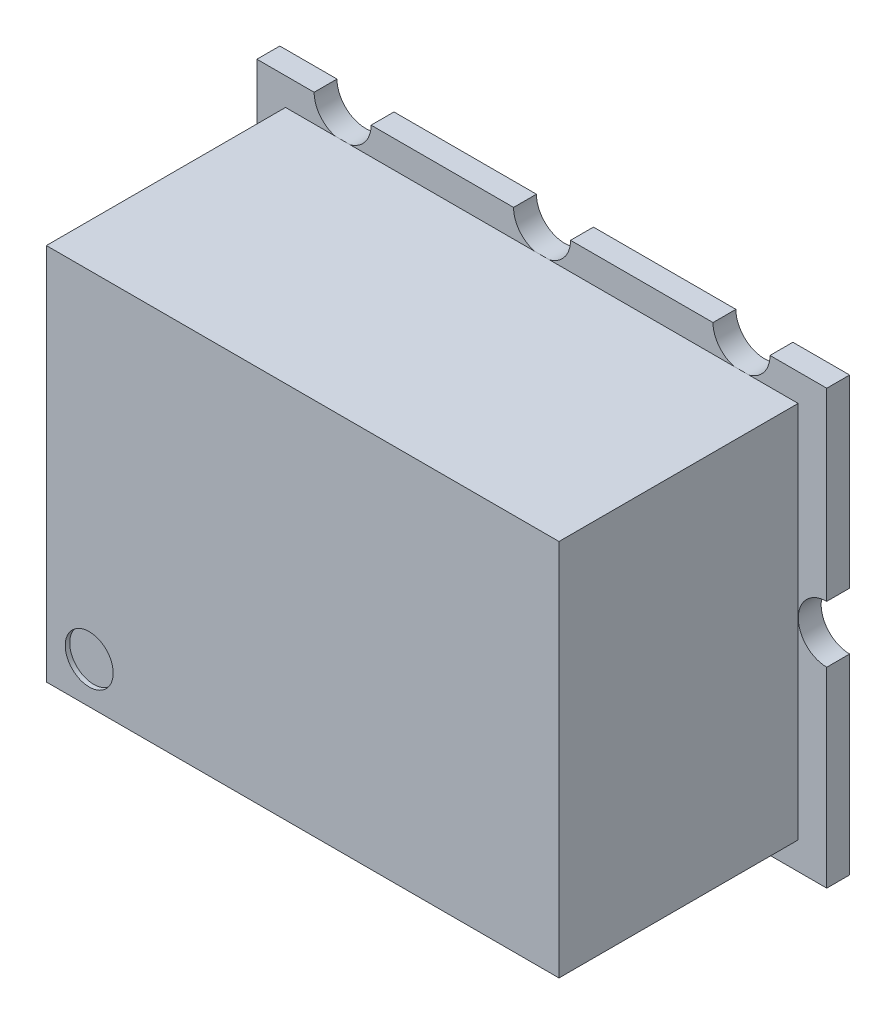
ISO-10303-21;
HEADER;
FILE_DESCRIPTION(('STEP AP214'),'2;1');
FILE_NAME('part.step','',(''),(''),'','','');
FILE_SCHEMA(('AUTOMOTIVE_DESIGN { 1 0 10303 214 1 1 1 1 }'));
ENDSEC;
DATA;
#1=APPLICATION_CONTEXT('core data for automotive mechanical design processes');
#2=APPLICATION_PROTOCOL_DEFINITION('international standard','automotive_design',2000,#1);
#3=PRODUCT_CONTEXT('',#1,'mechanical');
#4=PRODUCT('Part','Part','',(#3));
#5=PRODUCT_RELATED_PRODUCT_CATEGORY('part','',(#4));
#6=PRODUCT_DEFINITION_FORMATION('','',#4);
#7=PRODUCT_DEFINITION_CONTEXT('part definition',#1,'design');
#8=PRODUCT_DEFINITION('design','',#6,#7);
#9=PRODUCT_DEFINITION_SHAPE('','',#8);
#10=(LENGTH_UNIT() NAMED_UNIT(*) SI_UNIT(.MILLI.,.METRE.));
#11=(NAMED_UNIT(*) PLANE_ANGLE_UNIT() SI_UNIT($,.RADIAN.));
#12=(NAMED_UNIT(*) SI_UNIT($,.STERADIAN.) SOLID_ANGLE_UNIT());
#13=UNCERTAINTY_MEASURE_WITH_UNIT(LENGTH_MEASURE(1.E-05),#10,'distance_accuracy_value','');
#14=(GEOMETRIC_REPRESENTATION_CONTEXT(3) GLOBAL_UNCERTAINTY_ASSIGNED_CONTEXT((#13)) GLOBAL_UNIT_ASSIGNED_CONTEXT((#10,
#11,#12)) REPRESENTATION_CONTEXT('',''));
#15=CARTESIAN_POINT('',(0.,0.,0.));
#16=DIRECTION('',(0.,0.,1.));
#17=DIRECTION('',(1.,0.,0.));
#18=AXIS2_PLACEMENT_3D('',#15,#16,#17);
#19=CARTESIAN_POINT('',(0.000121919998536282,8.10247244868378E-05,5.85219199970364));
#20=DIRECTION('',(0.,-4.37113882867379E-08,0.999999999999999));
#21=DIRECTION('',(0.999999999999985,1.74845553146949E-07,0.));
#22=AXIS2_PLACEMENT_3D('',#19,#20,#21);
#23=PLANE('',#22);
#24=CARTESIAN_POINT('',(-4.75761193607172,-3.29649685020592,5.85219185560568));
#25=DIRECTION('',(0.,-4.37113882867379E-08,0.999999999999999));
#26=DIRECTION('',(0.999999999999985,1.74845553146949E-07,0.));
#27=AXIS2_PLACEMENT_3D('',#24,#25,#26);
#28=CIRCLE('',#27,0.53461435879999);
#29=CARTESIAN_POINT('',(-4.22299757727173,-3.29649675673098,5.85219185560568));
#30=VERTEX_POINT('',#29);
#31=EDGE_CURVE('E9',#30,#30,#28,.T.);
#32=ORIENTED_EDGE('',*,*,#31,.F.);
#33=EDGE_LOOP('',(#32));
#34=FACE_BOUND('',#33,.T.);
#35=DIRECTION('',(1.74845553146949E-07,-0.999999999999984,-4.37113882867386E-08));
#36=VECTOR('',#35,1.);
#37=CARTESIAN_POINT('',(-5.71237881656946,4.21275839991622,5.85219218384566));
#38=LINE('',#37,#36);
#39=CARTESIAN_POINT('',(-5.71237881656946,4.21275839991622,5.85219218384566));
#40=VERTEX_POINT('',#39);
#41=CARTESIAN_POINT('',(-5.7123773434333,-4.21259834807769,5.85219181556162));
#42=VERTEX_POINT('',#41);
#43=EDGE_CURVE('E22',#40,#42,#38,.T.);
#44=ORIENTED_EDGE('',*,*,#43,.T.);
#45=DIRECTION('',(0.999999999999985,1.74845553146949E-07,0.));
#46=VECTOR('',#45,1.);
#47=CARTESIAN_POINT('',(-5.7123773434333,-4.21259834807769,5.85219181556162));
#48=LINE('',#47,#46);
#49=CARTESIAN_POINT('',(5.71262265656653,-4.21259635046724,5.85219181556162));
#50=VERTEX_POINT('',#49);
#51=EDGE_CURVE('E393',#42,#50,#48,.T.);
#52=ORIENTED_EDGE('',*,*,#51,.T.);
#53=DIRECTION('',(-1.74845553146949E-07,0.999999999999984,4.37113882867386E-08));
#54=VECTOR('',#53,1.);
#55=CARTESIAN_POINT('',(5.71262265656653,-4.21259635046724,5.85219181556162));
#56=LINE('',#55,#54);
#57=CARTESIAN_POINT('',(5.71262118343037,4.21276039752666,5.85219218384566));
#58=VERTEX_POINT('',#57);
#59=EDGE_CURVE('E390',#50,#58,#56,.T.);
#60=ORIENTED_EDGE('',*,*,#59,.T.);
#61=DIRECTION('',(-0.999999999999985,-1.74845553146949E-07,0.));
#62=VECTOR('',#61,1.);
#63=CARTESIAN_POINT('',(5.71262118343037,4.21276039752666,5.85219218384566));
#64=LINE('',#63,#62);
#65=EDGE_CURVE('E388',#58,#40,#64,.T.);
#66=ORIENTED_EDGE('',*,*,#65,.T.);
#67=EDGE_LOOP('',(#44,#52,#60,#66));
#68=FACE_BOUND('',#67,.T.);
#69=ADVANCED_FACE('F15',(#34,#68),#23,.T.);
#70=CARTESIAN_POINT('',(-4.75761193607172,-3.29649684583478,5.75219185560568));
#71=DIRECTION('',(0.,-4.37113882867379E-08,0.999999999999999));
#72=DIRECTION('',(0.999999999999985,1.74845553146949E-07,0.));
#73=AXIS2_PLACEMENT_3D('',#70,#71,#72);
#74=CYLINDRICAL_SURFACE('',#73,0.53461435879999);
#75=ORIENTED_EDGE('',*,*,#31,.T.);
#76=DIRECTION('',(0.,-4.37113882867379E-08,0.999999999999999));
#77=VECTOR('',#76,1.);
#78=CARTESIAN_POINT('',(-4.22299757727174,-3.29649675235984,5.75219185560568));
#79=LINE('',#78,#77);
#80=CARTESIAN_POINT('',(-4.22299757727174,-3.29649675235984,5.75219185560568));
#81=VERTEX_POINT('',#80);
#82=EDGE_CURVE('E386',#81,#30,#79,.T.);
#83=ORIENTED_EDGE('',*,*,#82,.F.);
#84=CARTESIAN_POINT('',(-4.75761193607172,-3.29649684583478,5.75219185560568));
#85=DIRECTION('',(0.,-4.37113882867379E-08,0.999999999999999));
#86=DIRECTION('',(0.999999999999985,1.74845553146949E-07,0.));
#87=AXIS2_PLACEMENT_3D('',#84,#85,#86);
#88=CIRCLE('',#87,0.53461435879999);
#89=EDGE_CURVE('E383',#81,#81,#88,.T.);
#90=ORIENTED_EDGE('',*,*,#89,.F.);
#91=ORIENTED_EDGE('',*,*,#82,.T.);
#92=EDGE_LOOP('',(#75,#83,#90,#91));
#93=FACE_BOUND('',#92,.T.);
#94=ADVANCED_FACE('F435',(#93),#74,.F.);
#95=CARTESIAN_POINT('',(-5.7123788165695,4.21275863289792,0.522192183845666));
#96=DIRECTION('',(-0.999999999999985,-1.74845553146949E-07,0.));
#97=DIRECTION('',(1.74845553146949E-07,-0.999999999999984,-4.37113882867386E-08));
#98=AXIS2_PLACEMENT_3D('',#95,#96,#97);
#99=PLANE('',#98);
#100=DIRECTION('',(1.74845553146949E-07,-0.999999999999984,-4.37113882867386E-08));
#101=VECTOR('',#100,1.);
#102=CARTESIAN_POINT('',(-5.7123788165695,4.21275863289792,0.522192183845666));
#103=LINE('',#102,#101);
#104=CARTESIAN_POINT('',(-5.7123788165695,4.21275863289792,0.522192183845666));
#105=VERTEX_POINT('',#104);
#106=CARTESIAN_POINT('',(-5.71237734343334,-4.21259811509599,0.522191815561625));
#107=VERTEX_POINT('',#106);
#108=EDGE_CURVE('E380',#105,#107,#103,.T.);
#109=ORIENTED_EDGE('',*,*,#108,.T.);
#110=DIRECTION('',(0.,-4.37113882867379E-08,0.999999999999999));
#111=VECTOR('',#110,1.);
#112=CARTESIAN_POINT('',(-5.71237734343334,-4.21259811509599,0.522191815561625));
#113=LINE('',#112,#111);
#114=EDGE_CURVE('E377',#107,#42,#113,.T.);
#115=ORIENTED_EDGE('',*,*,#114,.T.);
#116=ORIENTED_EDGE('',*,*,#43,.F.);
#117=DIRECTION('',(0.,-4.37113882867379E-08,0.999999999999999));
#118=VECTOR('',#117,1.);
#119=CARTESIAN_POINT('',(-5.7123788165695,4.21275863289792,0.522192183845666));
#120=LINE('',#119,#118);
#121=EDGE_CURVE('E374',#105,#40,#120,.T.);
#122=ORIENTED_EDGE('',*,*,#121,.F.);
#123=EDGE_LOOP('',(#109,#115,#116,#122));
#124=FACE_BOUND('',#123,.T.);
#125=ADVANCED_FACE('F415',(#124),#99,.T.);
#126=CARTESIAN_POINT('',(-5.71237734343334,-4.21259811509599,0.522191815561625));
#127=DIRECTION('',(1.74845553146949E-07,-0.999999999999984,-4.37113882867386E-08));
#128=DIRECTION('',(0.999999999999985,1.74845553146949E-07,0.));
#129=AXIS2_PLACEMENT_3D('',#126,#127,#128);
#130=PLANE('',#129);
#131=DIRECTION('',(0.999999999999985,1.74845553146949E-07,0.));
#132=VECTOR('',#131,1.);
#133=CARTESIAN_POINT('',(-5.71237734343334,-4.21259811509599,0.522191815561625));
#134=LINE('',#133,#132);
#135=CARTESIAN_POINT('',(-0.168065411764872,-4.2125971456977,0.522191815561625));
#136=VERTEX_POINT('',#135);
#137=EDGE_CURVE('E371',#107,#136,#134,.T.);
#138=ORIENTED_EDGE('',*,*,#137,.T.);
#139=DIRECTION('',(0.999999999999985,1.74845553146949E-07,0.));
#140=VECTOR('',#139,1.);
#141=CARTESIAN_POINT('',(-0.168065411764869,-4.2125971456977,0.522191815561625));
#142=LINE('',#141,#140);
#143=CARTESIAN_POINT('',(0.168310724898024,-4.21259708688383,0.522191815561625));
#144=VERTEX_POINT('',#143);
#145=EDGE_CURVE('E368',#136,#144,#142,.T.);
#146=ORIENTED_EDGE('',*,*,#145,.T.);
#147=DIRECTION('',(0.999999999999985,1.74845553146949E-07,0.));
#148=VECTOR('',#147,1.);
#149=CARTESIAN_POINT('',(0.168310724898038,-4.21259708688383,0.522191815561625));
#150=LINE('',#149,#148);
#151=CARTESIAN_POINT('',(5.71262265656649,-4.21259611748554,0.522191815561625));
#152=VERTEX_POINT('',#151);
#153=EDGE_CURVE('E365',#144,#152,#150,.T.);
#154=ORIENTED_EDGE('',*,*,#153,.T.);
#155=DIRECTION('',(0.,-4.37113882867379E-08,0.999999999999999));
#156=VECTOR('',#155,1.);
#157=CARTESIAN_POINT('',(5.71262265656649,-4.21259611748554,0.522191815561625));
#158=LINE('',#157,#156);
#159=EDGE_CURVE('E362',#152,#50,#158,.T.);
#160=ORIENTED_EDGE('',*,*,#159,.T.);
#161=ORIENTED_EDGE('',*,*,#51,.F.);
#162=ORIENTED_EDGE('',*,*,#114,.F.);
#163=EDGE_LOOP('',(#138,#146,#154,#160,#161,#162));
#164=FACE_BOUND('',#163,.T.);
#165=ADVANCED_FACE('F401',(#164),#130,.T.);
#166=CARTESIAN_POINT('',(5.71262265656649,-4.21259611748554,0.522191815561625));
#167=DIRECTION('',(0.999999999999985,1.74845553146949E-07,0.));
#168=DIRECTION('',(-1.74845553146949E-07,0.999999999999984,4.37113882867386E-08));
#169=AXIS2_PLACEMENT_3D('',#166,#167,#168);
#170=PLANE('',#169);
#171=DIRECTION('',(-1.74845553146949E-07,0.999999999999984,4.37113882867386E-08));
#172=VECTOR('',#171,1.);
#173=CARTESIAN_POINT('',(5.71262265656649,-4.21259611748554,0.522191815561625));
#174=LINE('',#173,#172);
#175=CARTESIAN_POINT('',(5.71262118343033,4.21276063050836,0.522192183845666));
#176=VERTEX_POINT('',#175);
#177=EDGE_CURVE('E360',#152,#176,#174,.T.);
#178=ORIENTED_EDGE('',*,*,#177,.T.);
#179=DIRECTION('',(0.,-4.37113882867379E-08,0.999999999999999));
#180=VECTOR('',#179,1.);
#181=CARTESIAN_POINT('',(5.71262118343033,4.21276063050836,0.522192183845666));
#182=LINE('',#181,#180);
#183=EDGE_CURVE('E357',#176,#58,#182,.T.);
#184=ORIENTED_EDGE('',*,*,#183,.T.);
#185=ORIENTED_EDGE('',*,*,#59,.F.);
#186=ORIENTED_EDGE('',*,*,#159,.F.);
#187=EDGE_LOOP('',(#178,#184,#185,#186));
#188=FACE_BOUND('',#187,.T.);
#189=ADVANCED_FACE('F399',(#188),#170,.T.);
#190=CARTESIAN_POINT('',(5.71262118343033,4.21276063050836,0.522192183845666));
#191=DIRECTION('',(-1.74845553146949E-07,0.999999999999984,4.37113882867386E-08));
#192=DIRECTION('',(-0.999999999999985,-1.74845553146949E-07,0.));
#193=AXIS2_PLACEMENT_3D('',#190,#191,#192);
#194=PLANE('',#193);
#195=DIRECTION('',(-0.999999999999985,-1.74845553146949E-07,0.));
#196=VECTOR('',#195,1.);
#197=CARTESIAN_POINT('',(5.71262118343033,4.21276063050836,0.522192183845666));
#198=LINE('',#197,#196);
#199=CARTESIAN_POINT('',(4.61830925176178,4.21276043917279,0.522192183845666));
#200=VERTEX_POINT('',#199);
#201=EDGE_CURVE('E355',#176,#200,#198,.T.);
#202=ORIENTED_EDGE('',*,*,#201,.T.);
#203=DIRECTION('',(-0.999999999999985,-1.74845553146949E-07,0.));
#204=VECTOR('',#203,1.);
#205=CARTESIAN_POINT('',(4.61830925176178,4.21276043917279,0.522192183845666));
#206=LINE('',#205,#204);
#207=CARTESIAN_POINT('',(4.28193311509891,4.21276038035891,0.522192183845666));
#208=VERTEX_POINT('',#207);
#209=EDGE_CURVE('E352',#200,#208,#206,.T.);
#210=ORIENTED_EDGE('',*,*,#209,.T.);
#211=DIRECTION('',(-0.999999999999985,-1.74845553146949E-07,0.));
#212=VECTOR('',#211,1.);
#213=CARTESIAN_POINT('',(4.28193311509891,4.21276038035891,0.522192183845666));
#214=LINE('',#213,#212);
#215=CARTESIAN_POINT('',(0.173309251761861,4.2127596619843,0.522192183845666));
#216=VERTEX_POINT('',#215);
#217=EDGE_CURVE('E349',#208,#216,#214,.T.);
#218=ORIENTED_EDGE('',*,*,#217,.T.);
#219=DIRECTION('',(-0.999999999999985,-1.74845553146949E-07,0.));
#220=VECTOR('',#219,1.);
#221=CARTESIAN_POINT('',(0.173309251761862,4.2127596619843,0.522192183845666));
#222=LINE('',#221,#220);
#223=CARTESIAN_POINT('',(-0.163066884901022,4.21275960317043,0.522192183845666));
#224=VERTEX_POINT('',#223);
#225=EDGE_CURVE('E347',#216,#224,#222,.T.);
#226=ORIENTED_EDGE('',*,*,#225,.T.);
#227=DIRECTION('',(-0.999999999999985,-1.74845553146949E-07,0.));
#228=VECTOR('',#227,1.);
#229=CARTESIAN_POINT('',(-0.163066884901022,4.21275960317043,0.522192183845666));
#230=LINE('',#229,#228);
#231=CARTESIAN_POINT('',(-4.27169074823806,4.21275888479582,0.522192183845666));
#232=VERTEX_POINT('',#231);
#233=EDGE_CURVE('E345',#224,#232,#230,.T.);
#234=ORIENTED_EDGE('',*,*,#233,.T.);
#235=DIRECTION('',(-0.999999999999985,-1.74845553146949E-07,0.));
#236=VECTOR('',#235,1.);
#237=CARTESIAN_POINT('',(-4.27169074823806,4.21275888479582,0.522192183845666));
#238=LINE('',#237,#236);
#239=CARTESIAN_POINT('',(-4.60806688490099,4.21275882598195,0.522192183845666));
#240=VERTEX_POINT('',#239);
#241=EDGE_CURVE('E343',#232,#240,#238,.T.);
#242=ORIENTED_EDGE('',*,*,#241,.T.);
#243=DIRECTION('',(-0.999999999999985,-1.74845553146949E-07,0.));
#244=VECTOR('',#243,1.);
#245=CARTESIAN_POINT('',(-4.60806688490102,4.21275882598195,0.522192183845666));
#246=LINE('',#245,#244);
#247=EDGE_CURVE('E340',#240,#105,#246,.T.);
#248=ORIENTED_EDGE('',*,*,#247,.T.);
#249=ORIENTED_EDGE('',*,*,#121,.T.);
#250=ORIENTED_EDGE('',*,*,#65,.F.);
#251=ORIENTED_EDGE('',*,*,#183,.F.);
#252=EDGE_LOOP('',(#202,#210,#218,#226,#234,#242,#248,#249,#250,#251));
#253=FACE_BOUND('',#252,.T.);
#254=ADVANCED_FACE('F410',(#253),#194,.T.);
#255=CARTESIAN_POINT('',(0.000121919998535518,8.10290956256665E-05,5.75219199970364));
#256=DIRECTION('',(0.,-4.37113882867379E-08,0.999999999999999));
#257=DIRECTION('',(0.999999999999985,1.74845553146949E-07,0.));
#258=AXIS2_PLACEMENT_3D('',#255,#256,#257);
#259=PLANE('',#258);
#260=ORIENTED_EDGE('',*,*,#89,.T.);
#261=EDGE_LOOP('',(#260));
#262=FACE_BOUND('',#261,.T.);
#263=ADVANCED_FACE('F432',(#262),#259,.T.);
#264=CARTESIAN_POINT('',(0.000121919998495546,8.12577061864062E-05,0.522191999703645));
#265=DIRECTION('',(0.,-4.37113882867379E-08,0.999999999999999));
#266=DIRECTION('',(0.999999999999985,1.74845553146949E-07,0.));
#267=AXIS2_PLACEMENT_3D('',#264,#265,#266);
#268=PLANE('',#267);
#269=ORIENTED_EDGE('',*,*,#108,.F.);
#270=ORIENTED_EDGE('',*,*,#247,.F.);
#271=CARTESIAN_POINT('',(-4.43987892363123,4.82508048139185,0.522192210611094));
#272=DIRECTION('',(0.,4.37113882867379E-08,-0.999999999999999));
#273=DIRECTION('',(-0.264862931133474,-0.964286071511656,-4.21502808670601E-08));
#274=AXIS2_PLACEMENT_3D('',#271,#272,#273);
#275=CIRCLE('',#274,0.635);
#276=CARTESIAN_POINT('',(-5.07487892363121,4.82508037036493,0.522192210611094));
#277=VERTEX_POINT('',#276);
#278=EDGE_CURVE('E337',#240,#277,#275,.T.);
#279=ORIENTED_EDGE('',*,*,#278,.T.);
#280=DIRECTION('',(-0.999999999999985,-1.74845552450339E-07,0.));
#281=VECTOR('',#280,1.);
#282=CARTESIAN_POINT('',(-5.07487892363121,4.82508037036493,0.522192210611094));
#283=LINE('',#282,#281);
#284=CARTESIAN_POINT('',(-6.3498789236312,4.82508014743685,0.522192210611094));
#285=VERTEX_POINT('',#284);
#286=EDGE_CURVE('E335',#277,#285,#283,.T.);
#287=ORIENTED_EDGE('',*,*,#286,.T.);
#288=DIRECTION('',(1.74845553146949E-07,-0.999999999999984,-4.37113882867386E-08));
#289=VECTOR('',#288,1.);
#290=CARTESIAN_POINT('',(-6.3498789236312,4.82508014743685,0.522192210611094));
#291=LINE('',#290,#289);
#292=CARTESIAN_POINT('',(-6.34987820414175,0.710080147436914,0.522192030738731));
#293=VERTEX_POINT('',#292);
#294=EDGE_CURVE('E333',#285,#293,#291,.T.);
#295=ORIENTED_EDGE('',*,*,#294,.T.);
#296=CARTESIAN_POINT('',(-6.34987809311482,0.0750801474369238,0.522192002981999));
#297=DIRECTION('',(0.,4.37113882867379E-08,-0.999999999999999));
#298=DIRECTION('',(-1.74845553146949E-07,0.999999999999984,4.37113882867386E-08));
#299=AXIS2_PLACEMENT_3D('',#296,#297,#298);
#300=CIRCLE('',#299,0.635);
#301=CARTESIAN_POINT('',(-6.3498779820879,-0.559919852563065,0.522191975225268));
#302=VERTEX_POINT('',#301);
#303=EDGE_CURVE('E331',#293,#302,#300,.T.);
#304=ORIENTED_EDGE('',*,*,#303,.T.);
#305=DIRECTION('',(1.74845553146949E-07,-0.999999999999984,-4.37113882867386E-08));
#306=VECTOR('',#305,1.);
#307=CARTESIAN_POINT('',(-6.3498779820879,-0.559919852563065,0.522191975225268));
#308=LINE('',#307,#306);
#309=CARTESIAN_POINT('',(-6.34987723637161,-4.824919852563,0.522191788796197));
#310=VERTEX_POINT('',#309);
#311=EDGE_CURVE('E329',#302,#310,#308,.T.);
#312=ORIENTED_EDGE('',*,*,#311,.T.);
#313=DIRECTION('',(0.999999999999985,1.74845553146949E-07,0.));
#314=VECTOR('',#313,1.);
#315=CARTESIAN_POINT('',(-6.34987723637161,-4.824919852563,0.522191788796197));
#316=LINE('',#315,#314);
#317=CARTESIAN_POINT('',(-0.634877236371702,-4.82491885332066,0.522191788796197));
#318=VERTEX_POINT('',#317);
#319=EDGE_CURVE('E326',#310,#318,#316,.T.);
#320=ORIENTED_EDGE('',*,*,#319,.T.);
#321=CARTESIAN_POINT('',(0.000122763628288592,-4.82491874229373,0.522191788796197));
#322=DIRECTION('',(0.,4.37113882867379E-08,-0.999999999999999));
#323=DIRECTION('',(-0.999999999999985,-1.74845553146949E-07,0.));
#324=AXIS2_PLACEMENT_3D('',#321,#322,#323);
#325=CIRCLE('',#324,0.635);
#326=EDGE_CURVE('E324',#318,#136,#325,.T.);
#327=ORIENTED_EDGE('',*,*,#326,.T.);
#328=ORIENTED_EDGE('',*,*,#137,.F.);
#329=EDGE_LOOP('',(#269,#270,#279,#287,#295,#304,#312,#320,#327,#328));
#330=FACE_BOUND('',#329,.T.);
#331=ADVANCED_FACE('F423',(#330),#268,.T.);
#332=CARTESIAN_POINT('',(0.000121919998495546,8.12577061864062E-05,0.522191999703645));
#333=DIRECTION('',(0.,-4.37113882867379E-08,0.999999999999999));
#334=DIRECTION('',(0.999999999999985,1.74845553146949E-07,0.));
#335=AXIS2_PLACEMENT_3D('',#332,#333,#334);
#336=PLANE('',#335);
#337=CARTESIAN_POINT('',(0.000122763628288592,-4.82491874229373,0.522191788796197));
#338=DIRECTION('',(0.,4.37113882867379E-08,-0.999999999999999));
#339=DIRECTION('',(-0.264863268335678,0.964285978891398,4.21502808670607E-08));
#340=AXIS2_PLACEMENT_3D('',#337,#338,#339);
#341=CIRCLE('',#340,0.635);
#342=EDGE_CURVE('E322',#136,#144,#341,.T.);
#343=ORIENTED_EDGE('',*,*,#342,.T.);
#344=ORIENTED_EDGE('',*,*,#145,.F.);
#345=EDGE_LOOP('',(#343,#344));
#346=FACE_BOUND('',#345,.T.);
#347=ADVANCED_FACE('F421',(#346),#336,.F.);
#348=CARTESIAN_POINT('',(0.000121919998495546,8.12577061864062E-05,0.522191999703645));
#349=DIRECTION('',(0.,-4.37113882867379E-08,0.999999999999999));
#350=DIRECTION('',(0.999999999999985,1.74845553146949E-07,0.));
#351=AXIS2_PLACEMENT_3D('',#348,#349,#350);
#352=PLANE('',#351);
#353=ORIENTED_EDGE('',*,*,#153,.F.);
#354=CARTESIAN_POINT('',(0.000122763628288592,-4.82491874229373,0.522191788796197));
#355=DIRECTION('',(0.,4.37113882867379E-08,-0.999999999999999));
#356=DIRECTION('',(0.264862931133434,0.964286071511667,4.21502808670606E-08));
#357=AXIS2_PLACEMENT_3D('',#354,#355,#356);
#358=CIRCLE('',#357,0.635);
#359=CARTESIAN_POINT('',(0.635122763628279,-4.82491863126681,0.522191788796197));
#360=VERTEX_POINT('',#359);
#361=EDGE_CURVE('E320',#144,#360,#358,.T.);
#362=ORIENTED_EDGE('',*,*,#361,.T.);
#363=DIRECTION('',(0.999999999999985,1.74845553146949E-07,0.));
#364=VECTOR('',#363,1.);
#365=CARTESIAN_POINT('',(0.635122763628279,-4.82491863126681,0.522191788796197));
#366=LINE('',#365,#364);
#367=CARTESIAN_POINT('',(6.35012276362819,-4.82491763202447,0.522191788796197));
#368=VERTEX_POINT('',#367);
#369=EDGE_CURVE('E318',#360,#368,#366,.T.);
#370=ORIENTED_EDGE('',*,*,#369,.T.);
#371=DIRECTION('',(-1.74845553146949E-07,0.999999999999984,4.37113882867386E-08));
#372=VECTOR('',#371,1.);
#373=CARTESIAN_POINT('',(6.35012276362819,-4.82491763202447,0.522191788796197));
#374=LINE('',#373,#372);
#375=CARTESIAN_POINT('',(6.35012201791191,-0.559917632024542,0.522191975225268));
#376=VERTEX_POINT('',#375);
#377=EDGE_CURVE('E315',#368,#376,#374,.T.);
#378=ORIENTED_EDGE('',*,*,#377,.T.);
#379=CARTESIAN_POINT('',(6.35012190688498,0.0750823679754479,0.522192002981999));
#380=DIRECTION('',(0.,4.37113882867379E-08,-0.999999999999999));
#381=DIRECTION('',(1.74845553146949E-07,-0.999999999999984,-4.37113882867386E-08));
#382=AXIS2_PLACEMENT_3D('',#379,#380,#381);
#383=CIRCLE('',#382,0.635);
#384=CARTESIAN_POINT('',(6.35012179585806,0.710082367975437,0.522192030738731));
#385=VERTEX_POINT('',#384);
#386=EDGE_CURVE('E313',#376,#385,#383,.T.);
#387=ORIENTED_EDGE('',*,*,#386,.T.);
#388=DIRECTION('',(-1.74845553146949E-07,0.999999999999984,4.37113882867386E-08));
#389=VECTOR('',#388,1.);
#390=CARTESIAN_POINT('',(6.35012179585806,0.710082367975437,0.522192030738731));
#391=LINE('',#390,#389);
#392=CARTESIAN_POINT('',(6.3501210763686,4.82508236797537,0.522192210611094));
#393=VERTEX_POINT('',#392);
#394=EDGE_CURVE('E311',#385,#393,#391,.T.);
#395=ORIENTED_EDGE('',*,*,#394,.T.);
#396=DIRECTION('',(-0.999999999999985,-1.74845553146949E-07,0.));
#397=VECTOR('',#396,1.);
#398=CARTESIAN_POINT('',(6.3501210763686,4.82508236797537,0.522192210611094));
#399=LINE('',#398,#397);
#400=CARTESIAN_POINT('',(5.08512107636863,4.82508214679575,0.522192210611094));
#401=VERTEX_POINT('',#400);
#402=EDGE_CURVE('E309',#393,#401,#399,.T.);
#403=ORIENTED_EDGE('',*,*,#402,.T.);
#404=CARTESIAN_POINT('',(4.45012107636863,4.82508203576882,0.522192210611094));
#405=DIRECTION('',(0.,4.37113882867379E-08,-0.999999999999999));
#406=DIRECTION('',(0.999999999999985,1.74845553146949E-07,0.));
#407=AXIS2_PLACEMENT_3D('',#404,#405,#406);
#408=CIRCLE('',#407,0.635);
#409=EDGE_CURVE('E306',#401,#200,#408,.T.);
#410=ORIENTED_EDGE('',*,*,#409,.T.);
#411=ORIENTED_EDGE('',*,*,#201,.F.);
#412=ORIENTED_EDGE('',*,*,#177,.F.);
#413=EDGE_LOOP('',(#353,#362,#370,#378,#387,#395,#403,#410,#411,#412));
#414=FACE_BOUND('',#413,.T.);
#415=ADVANCED_FACE('F406',(#414),#352,.T.);
#416=CARTESIAN_POINT('',(0.000121919998495546,8.12577061864062E-05,0.522191999703645));
#417=DIRECTION('',(0.,-4.37113882867379E-08,0.999999999999999));
#418=DIRECTION('',(0.999999999999985,1.74845553146949E-07,0.));
#419=AXIS2_PLACEMENT_3D('',#416,#417,#418);
#420=PLANE('',#419);
#421=CARTESIAN_POINT('',(4.45012107636863,4.82508203576882,0.522192210611094));
#422=DIRECTION('',(0.,4.37113882867379E-08,-0.999999999999999));
#423=DIRECTION('',(0.264863268335671,-0.964285978891399,-4.21502808670607E-08));
#424=AXIS2_PLACEMENT_3D('',#421,#422,#423);
#425=CIRCLE('',#424,0.635);
#426=EDGE_CURVE('E303',#200,#208,#425,.T.);
#427=ORIENTED_EDGE('',*,*,#426,.T.);
#428=ORIENTED_EDGE('',*,*,#209,.F.);
#429=EDGE_LOOP('',(#427,#428));
#430=FACE_BOUND('',#429,.T.);
#431=ADVANCED_FACE('F430',(#430),#420,.F.);
#432=CARTESIAN_POINT('',(0.000121919998495546,8.12577061864062E-05,0.522191999703645));
#433=DIRECTION('',(0.,-4.37113882867379E-08,0.999999999999999));
#434=DIRECTION('',(0.999999999999985,1.74845553146949E-07,0.));
#435=AXIS2_PLACEMENT_3D('',#432,#433,#434);
#436=PLANE('',#435);
#437=ORIENTED_EDGE('',*,*,#217,.F.);
#438=CARTESIAN_POINT('',(4.45012107636863,4.82508203576882,0.522192210611094));
#439=DIRECTION('',(0.,4.37113882867379E-08,-0.999999999999999));
#440=DIRECTION('',(-0.264862931133427,-0.964286071511669,-4.21502808670607E-08));
#441=AXIS2_PLACEMENT_3D('',#438,#439,#440);
#442=CIRCLE('',#441,0.635);
#443=CARTESIAN_POINT('',(3.81512107636864,4.82508192474189,0.522192210611094));
#444=VERTEX_POINT('',#443);
#445=EDGE_CURVE('E301',#208,#444,#442,.T.);
#446=ORIENTED_EDGE('',*,*,#445,.T.);
#447=DIRECTION('',(-0.999999999999985,-1.74845552867208E-07,0.));
#448=VECTOR('',#447,1.);
#449=CARTESIAN_POINT('',(3.81512107636864,4.82508192474189,0.522192210611094));
#450=LINE('',#449,#448);
#451=CARTESIAN_POINT('',(0.640121076368697,4.82508136960726,0.522192210611094));
#452=VERTEX_POINT('',#451);
#453=EDGE_CURVE('E299',#444,#452,#450,.T.);
#454=ORIENTED_EDGE('',*,*,#453,.T.);
#455=CARTESIAN_POINT('',(0.00512107636870676,4.82508125858034,0.522192210611094));
#456=DIRECTION('',(0.,4.37113882867379E-08,-0.999999999999999));
#457=DIRECTION('',(0.999999999999985,1.74845553146949E-07,0.));
#458=AXIS2_PLACEMENT_3D('',#455,#456,#457);
#459=CIRCLE('',#458,0.635);
#460=EDGE_CURVE('E296',#452,#216,#459,.T.);
#461=ORIENTED_EDGE('',*,*,#460,.T.);
#462=EDGE_LOOP('',(#437,#446,#454,#461));
#463=FACE_BOUND('',#462,.T.);
#464=ADVANCED_FACE('F497',(#463),#436,.T.);
#465=CARTESIAN_POINT('',(0.000121919998495546,8.12577061864062E-05,0.522191999703645));
#466=DIRECTION('',(0.,-4.37113882867379E-08,0.999999999999999));
#467=DIRECTION('',(0.999999999999985,1.74845553146949E-07,0.));
#468=AXIS2_PLACEMENT_3D('',#465,#466,#467);
#469=PLANE('',#468);
#470=CARTESIAN_POINT('',(0.00512107636870676,4.82508125858034,0.522192210611094));
#471=DIRECTION('',(0.,4.37113882867379E-08,-0.999999999999999));
#472=DIRECTION('',(0.264863268335672,-0.964285978891399,-4.21502808670607E-08));
#473=AXIS2_PLACEMENT_3D('',#470,#471,#472);
#474=CIRCLE('',#473,0.635);
#475=EDGE_CURVE('E293',#216,#224,#474,.T.);
#476=ORIENTED_EDGE('',*,*,#475,.T.);
#477=ORIENTED_EDGE('',*,*,#225,.F.);
#478=EDGE_LOOP('',(#476,#477));
#479=FACE_BOUND('',#478,.T.);
#480=ADVANCED_FACE('F506',(#479),#469,.F.);
#481=CARTESIAN_POINT('',(0.000121919998495546,8.12577061864062E-05,0.522191999703645));
#482=DIRECTION('',(0.,-4.37113882867379E-08,0.999999999999999));
#483=DIRECTION('',(0.999999999999985,1.74845553146949E-07,0.));
#484=AXIS2_PLACEMENT_3D('',#481,#482,#483);
#485=PLANE('',#484);
#486=ORIENTED_EDGE('',*,*,#233,.F.);
#487=CARTESIAN_POINT('',(0.00512107636870676,4.82508125858034,0.522192210611094));
#488=DIRECTION('',(0.,4.37113882867379E-08,-0.999999999999999));
#489=DIRECTION('',(-0.264862931133435,-0.964286071511667,-4.21502808670606E-08));
#490=AXIS2_PLACEMENT_3D('',#487,#488,#489);
#491=CIRCLE('',#490,0.635);
#492=CARTESIAN_POINT('',(-0.629878923631285,4.82508114755341,0.522192210611094));
#493=VERTEX_POINT('',#492);
#494=EDGE_CURVE('E291',#224,#493,#491,.T.);
#495=ORIENTED_EDGE('',*,*,#494,.T.);
#496=DIRECTION('',(-0.999999999999985,-1.74845552867208E-07,0.));
#497=VECTOR('',#496,1.);
#498=CARTESIAN_POINT('',(-0.629878923631285,4.82508114755341,0.522192210611094));
#499=LINE('',#498,#497);
#500=CARTESIAN_POINT('',(-3.80487892363124,4.82508059241878,0.522192210611094));
#501=VERTEX_POINT('',#500);
#502=EDGE_CURVE('E185',#493,#501,#499,.T.);
#503=ORIENTED_EDGE('',*,*,#502,.T.);
#504=CARTESIAN_POINT('',(-4.43987892363123,4.82508048139185,0.522192210611094));
#505=DIRECTION('',(0.,4.37113882867379E-08,-0.999999999999999));
#506=DIRECTION('',(0.999999999999985,1.74845553146949E-07,0.));
#507=AXIS2_PLACEMENT_3D('',#504,#505,#506);
#508=CIRCLE('',#507,0.635);
#509=EDGE_CURVE('E287',#501,#232,#508,.T.);
#510=ORIENTED_EDGE('',*,*,#509,.T.);
#511=EDGE_LOOP('',(#486,#495,#503,#510));
#512=FACE_BOUND('',#511,.T.);
#513=ADVANCED_FACE('F511',(#512),#485,.T.);
#514=CARTESIAN_POINT('',(0.000121919998495546,8.12577061864062E-05,0.522191999703645));
#515=DIRECTION('',(0.,-4.37113882867379E-08,0.999999999999999));
#516=DIRECTION('',(0.999999999999985,1.74845553146949E-07,0.));
#517=AXIS2_PLACEMENT_3D('',#514,#515,#516);
#518=PLANE('',#517);
#519=CARTESIAN_POINT('',(-4.43987892363123,4.82508048139185,0.522192210611094));
#520=DIRECTION('',(0.,4.37113882867379E-08,-0.999999999999999));
#521=DIRECTION('',(0.264863268335667,-0.964285978891401,-4.21502808670608E-08));
#522=AXIS2_PLACEMENT_3D('',#519,#520,#521);
#523=CIRCLE('',#522,0.635);
#524=EDGE_CURVE('E284',#232,#240,#523,.T.);
#525=ORIENTED_EDGE('',*,*,#524,.T.);
#526=ORIENTED_EDGE('',*,*,#241,.F.);
#527=EDGE_LOOP('',(#525,#526));
#528=FACE_BOUND('',#527,.T.);
#529=ADVANCED_FACE('F520',(#528),#518,.F.);
#530=CARTESIAN_POINT('',(-4.43987892363124,4.82508050368466,0.0121922106110942));
#531=DIRECTION('',(0.,4.37113882867379E-08,-0.999999999999999));
#532=DIRECTION('',(0.999999999999985,1.74845553146949E-07,0.));
#533=AXIS2_PLACEMENT_3D('',#530,#531,#532);
#534=CYLINDRICAL_SURFACE('',#533,0.635);
#535=ORIENTED_EDGE('',*,*,#524,.F.);
#536=ORIENTED_EDGE('',*,*,#509,.F.);
#537=DIRECTION('',(0.,-4.37113882867379E-08,0.999999999999999));
#538=VECTOR('',#537,1.);
#539=CARTESIAN_POINT('',(-3.80487892363124,4.82508061471159,0.0121922106110942));
#540=LINE('',#539,#538);
#541=CARTESIAN_POINT('',(-3.80487892363125,4.82508061471159,0.0121922106110942));
#542=VERTEX_POINT('',#541);
#543=EDGE_CURVE('E282',#542,#501,#540,.T.);
#544=ORIENTED_EDGE('',*,*,#543,.F.);
#545=CARTESIAN_POINT('',(-4.43987892363124,4.82508050368466,0.0121922106110942));
#546=DIRECTION('',(0.,4.37113882867379E-08,-0.999999999999999));
#547=DIRECTION('',(0.999999999999985,1.74845553146949E-07,0.));
#548=AXIS2_PLACEMENT_3D('',#545,#546,#547);
#549=CIRCLE('',#548,0.635);
#550=CARTESIAN_POINT('',(-5.07487892363122,4.82508039265773,0.0121922106110942));
#551=VERTEX_POINT('',#550);
#552=EDGE_CURVE('E203',#542,#551,#549,.T.);
#553=ORIENTED_EDGE('',*,*,#552,.T.);
#554=DIRECTION('',(0.,-4.37113882867379E-08,0.999999999999999));
#555=VECTOR('',#554,1.);
#556=CARTESIAN_POINT('',(-5.07487892363122,4.82508039265773,0.0121922106110942));
#557=LINE('',#556,#555);
#558=EDGE_CURVE('E278',#551,#277,#557,.T.);
#559=ORIENTED_EDGE('',*,*,#558,.T.);
#560=ORIENTED_EDGE('',*,*,#278,.F.);
#561=EDGE_LOOP('',(#535,#536,#544,#553,#559,#560));
#562=FACE_BOUND('',#561,.T.);
#563=ADVANCED_FACE('F524',(#562),#534,.F.);
#564=CARTESIAN_POINT('',(-5.07487892363122,4.82508039265773,0.0121922106110942));
#565=DIRECTION('',(-1.74845552450338E-07,0.999999999999984,4.37113882867386E-08));
#566=DIRECTION('',(-0.999999999999985,-1.74845552450339E-07,0.));
#567=AXIS2_PLACEMENT_3D('',#564,#565,#566);
#568=PLANE('',#567);
#569=DIRECTION('',(-0.999999999999985,-1.74845552450339E-07,0.));
#570=VECTOR('',#569,1.);
#571=CARTESIAN_POINT('',(-5.07487892363122,4.82508039265773,0.0121922106110942));
#572=LINE('',#571,#570);
#573=CARTESIAN_POINT('',(-6.3498789236312,4.82508016972965,0.0121922106110942));
#574=VERTEX_POINT('',#573);
#575=EDGE_CURVE('E275',#551,#574,#572,.T.);
#576=ORIENTED_EDGE('',*,*,#575,.T.);
#577=DIRECTION('',(0.,-4.37113882867379E-08,0.999999999999999));
#578=VECTOR('',#577,1.);
#579=CARTESIAN_POINT('',(-6.3498789236312,4.82508016972965,0.0121922106110942));
#580=LINE('',#579,#578);
#581=EDGE_CURVE('E272',#574,#285,#580,.T.);
#582=ORIENTED_EDGE('',*,*,#581,.T.);
#583=ORIENTED_EDGE('',*,*,#286,.F.);
#584=ORIENTED_EDGE('',*,*,#558,.F.);
#585=EDGE_LOOP('',(#576,#582,#583,#584));
#586=FACE_BOUND('',#585,.T.);
#587=ADVANCED_FACE('F536',(#586),#568,.T.);
#588=CARTESIAN_POINT('',(-6.3498789236312,4.82508016972966,0.0121922106110942));
#589=DIRECTION('',(-0.999999999999985,-1.74845553146949E-07,0.));
#590=DIRECTION('',(1.74845553146949E-07,-0.999999999999984,-4.37113882867386E-08));
#591=AXIS2_PLACEMENT_3D('',#588,#589,#590);
#592=PLANE('',#591);
#593=DIRECTION('',(1.74845553146949E-07,-0.999999999999984,-4.37113882867386E-08));
#594=VECTOR('',#593,1.);
#595=CARTESIAN_POINT('',(-6.3498789236312,4.82508016972965,0.0121922106110942));
#596=LINE('',#595,#594);
#597=CARTESIAN_POINT('',(-6.34987820414175,0.710080169729721,0.0121920307387314));
#598=VERTEX_POINT('',#597);
#599=EDGE_CURVE('E269',#574,#598,#596,.T.);
#600=ORIENTED_EDGE('',*,*,#599,.T.);
#601=DIRECTION('',(0.,-4.37113882867379E-08,0.999999999999999));
#602=VECTOR('',#601,1.);
#603=CARTESIAN_POINT('',(-6.34987820414175,0.710080169729722,0.0121920307387314));
#604=LINE('',#603,#602);
#605=EDGE_CURVE('E266',#598,#293,#604,.T.);
#606=ORIENTED_EDGE('',*,*,#605,.T.);
#607=ORIENTED_EDGE('',*,*,#294,.F.);
#608=ORIENTED_EDGE('',*,*,#581,.F.);
#609=EDGE_LOOP('',(#600,#606,#607,#608));
#610=FACE_BOUND('',#609,.T.);
#611=ADVANCED_FACE('F545',(#610),#592,.T.);
#612=CARTESIAN_POINT('',(-6.34987809311483,0.0750801697297318,0.0121920029819998));
#613=DIRECTION('',(0.,4.37113882867379E-08,-0.999999999999999));
#614=DIRECTION('',(-1.74845553146949E-07,0.999999999999984,4.37113882867386E-08));
#615=AXIS2_PLACEMENT_3D('',#612,#613,#614);
#616=CYLINDRICAL_SURFACE('',#615,0.635);
#617=CARTESIAN_POINT('',(-6.34987809311483,0.0750801697297318,0.0121920029819998));
#618=DIRECTION('',(0.,4.37113882867379E-08,-0.999999999999999));
#619=DIRECTION('',(-1.74845553146949E-07,0.999999999999984,4.37113882867386E-08));
#620=AXIS2_PLACEMENT_3D('',#617,#618,#619);
#621=CIRCLE('',#620,0.635);
#622=CARTESIAN_POINT('',(-6.3498779820879,-0.559919830270257,0.0121919752252683));
#623=VERTEX_POINT('',#622);
#624=EDGE_CURVE('E263',#598,#623,#621,.T.);
#625=ORIENTED_EDGE('',*,*,#624,.T.);
#626=DIRECTION('',(0.,-4.37113882867379E-08,0.999999999999999));
#627=VECTOR('',#626,1.);
#628=CARTESIAN_POINT('',(-6.3498779820879,-0.559919830270257,0.0121919752252683));
#629=LINE('',#628,#627);
#630=EDGE_CURVE('E260',#623,#302,#629,.T.);
#631=ORIENTED_EDGE('',*,*,#630,.T.);
#632=ORIENTED_EDGE('',*,*,#303,.F.);
#633=ORIENTED_EDGE('',*,*,#605,.F.);
#634=EDGE_LOOP('',(#625,#631,#632,#633));
#635=FACE_BOUND('',#634,.T.);
#636=ADVANCED_FACE('F554',(#635),#616,.F.);
#637=CARTESIAN_POINT('',(-6.3498779820879,-0.559919830270257,0.0121919752252683));
#638=DIRECTION('',(-0.999999999999985,-1.74845553146949E-07,0.));
#639=DIRECTION('',(1.74845553146949E-07,-0.999999999999984,-4.37113882867386E-08));
#640=AXIS2_PLACEMENT_3D('',#637,#638,#639);
#641=PLANE('',#640);
#642=DIRECTION('',(1.74845553146949E-07,-0.999999999999984,-4.37113882867386E-08));
#643=VECTOR('',#642,1.);
#644=CARTESIAN_POINT('',(-6.3498779820879,-0.559919830270257,0.0121919752252683));
#645=LINE('',#644,#643);
#646=CARTESIAN_POINT('',(-6.34987723637162,-4.82491983027019,0.0121917887961972));
#647=VERTEX_POINT('',#646);
#648=EDGE_CURVE('E258',#623,#647,#645,.T.);
#649=ORIENTED_EDGE('',*,*,#648,.T.);
#650=DIRECTION('',(0.,-4.37113882867379E-08,0.999999999999999));
#651=VECTOR('',#650,1.);
#652=CARTESIAN_POINT('',(-6.34987723637162,-4.82491983027019,0.0121917887961972));
#653=LINE('',#652,#651);
#654=EDGE_CURVE('E255',#647,#310,#653,.T.);
#655=ORIENTED_EDGE('',*,*,#654,.T.);
#656=ORIENTED_EDGE('',*,*,#311,.F.);
#657=ORIENTED_EDGE('',*,*,#630,.F.);
#658=EDGE_LOOP('',(#649,#655,#656,#657));
#659=FACE_BOUND('',#658,.T.);
#660=ADVANCED_FACE('F563',(#659),#641,.T.);
#661=CARTESIAN_POINT('',(-6.34987723637162,-4.82491983027019,0.0121917887961972));
#662=DIRECTION('',(1.74845553146949E-07,-0.999999999999984,-4.37113882867386E-08));
#663=DIRECTION('',(0.999999999999985,1.74845553146949E-07,0.));
#664=AXIS2_PLACEMENT_3D('',#661,#662,#663);
#665=PLANE('',#664);
#666=DIRECTION('',(0.999999999999985,1.74845553146949E-07,0.));
#667=VECTOR('',#666,1.);
#668=CARTESIAN_POINT('',(-6.34987723637162,-4.82491983027019,0.0121917887961972));
#669=LINE('',#668,#667);
#670=CARTESIAN_POINT('',(-0.634877236371706,-4.82491883102785,0.0121917887961972));
#671=VERTEX_POINT('',#670);
#672=EDGE_CURVE('E252',#647,#671,#669,.T.);
#673=ORIENTED_EDGE('',*,*,#672,.T.);
#674=DIRECTION('',(0.,-4.37113882867379E-08,0.999999999999999));
#675=VECTOR('',#674,1.);
#676=CARTESIAN_POINT('',(-0.634877236371703,-4.82491883102785,0.0121917887961972));
#677=LINE('',#676,#675);
#678=EDGE_CURVE('E249',#671,#318,#677,.T.);
#679=ORIENTED_EDGE('',*,*,#678,.T.);
#680=ORIENTED_EDGE('',*,*,#319,.F.);
#681=ORIENTED_EDGE('',*,*,#654,.F.);
#682=EDGE_LOOP('',(#673,#679,#680,#681));
#683=FACE_BOUND('',#682,.T.);
#684=ADVANCED_FACE('F572',(#683),#665,.T.);
#685=CARTESIAN_POINT('',(0.000122763628284694,-4.82491872000093,0.0121917887961972));
#686=DIRECTION('',(0.,4.37113882867379E-08,-0.999999999999999));
#687=DIRECTION('',(-0.999999999999985,-1.74845553146949E-07,0.));
#688=AXIS2_PLACEMENT_3D('',#685,#686,#687);
#689=CYLINDRICAL_SURFACE('',#688,0.635);
#690=ORIENTED_EDGE('',*,*,#342,.F.);
#691=ORIENTED_EDGE('',*,*,#326,.F.);
#692=ORIENTED_EDGE('',*,*,#678,.F.);
#693=CARTESIAN_POINT('',(0.000122763628284694,-4.82491872000093,0.0121917887961972));
#694=DIRECTION('',(0.,4.37113882867379E-08,-0.999999999999999));
#695=DIRECTION('',(-0.999999999999985,-1.74845553146949E-07,0.));
#696=AXIS2_PLACEMENT_3D('',#693,#694,#695);
#697=CIRCLE('',#696,0.635);
#698=CARTESIAN_POINT('',(0.635122763628275,-4.824918608974,0.0121917887961972));
#699=VERTEX_POINT('',#698);
#700=EDGE_CURVE('E246',#671,#699,#697,.T.);
#701=ORIENTED_EDGE('',*,*,#700,.T.);
#702=DIRECTION('',(0.,-4.37113882867379E-08,0.999999999999999));
#703=VECTOR('',#702,1.);
#704=CARTESIAN_POINT('',(0.635122763628275,-4.824918608974,0.0121917887961972));
#705=LINE('',#704,#703);
#706=EDGE_CURVE('E243',#699,#360,#705,.T.);
#707=ORIENTED_EDGE('',*,*,#706,.T.);
#708=ORIENTED_EDGE('',*,*,#361,.F.);
#709=EDGE_LOOP('',(#690,#691,#692,#701,#707,#708));
#710=FACE_BOUND('',#709,.T.);
#711=ADVANCED_FACE('F419',(#710),#689,.F.);
#712=CARTESIAN_POINT('',(0.635122763628275,-4.824918608974,0.0121917887961972));
#713=DIRECTION('',(1.74845553146949E-07,-0.999999999999984,-4.37113882867386E-08));
#714=DIRECTION('',(0.999999999999985,1.74845553146949E-07,0.));
#715=AXIS2_PLACEMENT_3D('',#712,#713,#714);
#716=PLANE('',#715);
#717=DIRECTION('',(0.999999999999985,1.74845553146949E-07,0.));
#718=VECTOR('',#717,1.);
#719=CARTESIAN_POINT('',(0.635122763628275,-4.824918608974,0.0121917887961972));
#720=LINE('',#719,#718);
#721=CARTESIAN_POINT('',(6.35012276362819,-4.82491760973167,0.0121917887961972));
#722=VERTEX_POINT('',#721);
#723=EDGE_CURVE('E240',#699,#722,#720,.T.);
#724=ORIENTED_EDGE('',*,*,#723,.T.);
#725=DIRECTION('',(0.,-4.37113882867379E-08,0.999999999999999));
#726=VECTOR('',#725,1.);
#727=CARTESIAN_POINT('',(6.35012276362819,-4.82491760973167,0.0121917887961972));
#728=LINE('',#727,#726);
#729=EDGE_CURVE('E237',#722,#368,#728,.T.);
#730=ORIENTED_EDGE('',*,*,#729,.T.);
#731=ORIENTED_EDGE('',*,*,#369,.F.);
#732=ORIENTED_EDGE('',*,*,#706,.F.);
#733=EDGE_LOOP('',(#724,#730,#731,#732));
#734=FACE_BOUND('',#733,.T.);
#735=ADVANCED_FACE('F589',(#734),#716,.T.);
#736=CARTESIAN_POINT('',(6.35012276362819,-4.82491760973167,0.0121917887961972));
#737=DIRECTION('',(0.999999999999985,1.74845553146949E-07,0.));
#738=DIRECTION('',(-1.74845553146949E-07,0.999999999999984,4.37113882867386E-08));
#739=AXIS2_PLACEMENT_3D('',#736,#737,#738);
#740=PLANE('',#739);
#741=DIRECTION('',(-1.74845553146949E-07,0.999999999999984,4.37113882867386E-08));
#742=VECTOR('',#741,1.);
#743=CARTESIAN_POINT('',(6.35012276362819,-4.82491760973167,0.0121917887961972));
#744=LINE('',#743,#742);
#745=CARTESIAN_POINT('',(6.3501220179119,-0.559917609731734,0.0121919752252683));
#746=VERTEX_POINT('',#745);
#747=EDGE_CURVE('E235',#722,#746,#744,.T.);
#748=ORIENTED_EDGE('',*,*,#747,.T.);
#749=DIRECTION('',(0.,-4.37113882867379E-08,0.999999999999999));
#750=VECTOR('',#749,1.);
#751=CARTESIAN_POINT('',(6.3501220179119,-0.559917609731732,0.0121919752252683));
#752=LINE('',#751,#750);
#753=EDGE_CURVE('E232',#746,#376,#752,.T.);
#754=ORIENTED_EDGE('',*,*,#753,.T.);
#755=ORIENTED_EDGE('',*,*,#377,.F.);
#756=ORIENTED_EDGE('',*,*,#729,.F.);
#757=EDGE_LOOP('',(#748,#754,#755,#756));
#758=FACE_BOUND('',#757,.T.);
#759=ADVANCED_FACE('F597',(#758),#740,.T.);
#760=CARTESIAN_POINT('',(6.35012190688498,0.0750823902682559,0.0121920029819998));
#761=DIRECTION('',(0.,4.37113882867379E-08,-0.999999999999999));
#762=DIRECTION('',(1.74845553146949E-07,-0.999999999999984,-4.37113882867386E-08));
#763=AXIS2_PLACEMENT_3D('',#760,#761,#762);
#764=CYLINDRICAL_SURFACE('',#763,0.635);
#765=CARTESIAN_POINT('',(6.35012190688498,0.0750823902682559,0.0121920029819998));
#766=DIRECTION('',(0.,4.37113882867379E-08,-0.999999999999999));
#767=DIRECTION('',(1.74845553146949E-07,-0.999999999999984,-4.37113882867386E-08));
#768=AXIS2_PLACEMENT_3D('',#765,#766,#767);
#769=CIRCLE('',#768,0.635);
#770=CARTESIAN_POINT('',(6.35012179585805,0.710082390268245,0.0121920307387314));
#771=VERTEX_POINT('',#770);
#772=EDGE_CURVE('E229',#746,#771,#769,.T.);
#773=ORIENTED_EDGE('',*,*,#772,.T.);
#774=DIRECTION('',(0.,-4.37113882867379E-08,0.999999999999999));
#775=VECTOR('',#774,1.);
#776=CARTESIAN_POINT('',(6.35012179585805,0.710082390268245,0.0121920307387314));
#777=LINE('',#776,#775);
#778=EDGE_CURVE('E226',#771,#385,#777,.T.);
#779=ORIENTED_EDGE('',*,*,#778,.T.);
#780=ORIENTED_EDGE('',*,*,#386,.F.);
#781=ORIENTED_EDGE('',*,*,#753,.F.);
#782=EDGE_LOOP('',(#773,#779,#780,#781));
#783=FACE_BOUND('',#782,.T.);
#784=ADVANCED_FACE('F606',(#783),#764,.F.);
#785=CARTESIAN_POINT('',(6.35012179585805,0.710082390268245,0.0121920307387314));
#786=DIRECTION('',(0.999999999999985,1.74845553146949E-07,0.));
#787=DIRECTION('',(-1.74845553146949E-07,0.999999999999984,4.37113882867386E-08));
#788=AXIS2_PLACEMENT_3D('',#785,#786,#787);
#789=PLANE('',#788);
#790=DIRECTION('',(-1.74845553146949E-07,0.999999999999984,4.37113882867386E-08));
#791=VECTOR('',#790,1.);
#792=CARTESIAN_POINT('',(6.35012179585805,0.710082390268245,0.0121920307387314));
#793=LINE('',#792,#791);
#794=CARTESIAN_POINT('',(6.3501210763686,4.82508239026818,0.0121922106110942));
#795=VERTEX_POINT('',#794);
#796=EDGE_CURVE('E223',#771,#795,#793,.T.);
#797=ORIENTED_EDGE('',*,*,#796,.T.);
#798=DIRECTION('',(0.,-4.37113882867379E-08,0.999999999999999));
#799=VECTOR('',#798,1.);
#800=CARTESIAN_POINT('',(6.3501210763686,4.82508239026818,0.0121922106110942));
#801=LINE('',#800,#799);
#802=EDGE_CURVE('E220',#795,#393,#801,.T.);
#803=ORIENTED_EDGE('',*,*,#802,.T.);
#804=ORIENTED_EDGE('',*,*,#394,.F.);
#805=ORIENTED_EDGE('',*,*,#778,.F.);
#806=EDGE_LOOP('',(#797,#803,#804,#805));
#807=FACE_BOUND('',#806,.T.);
#808=ADVANCED_FACE('F615',(#807),#789,.T.);
#809=CARTESIAN_POINT('',(6.3501210763686,4.82508239026818,0.0121922106110942));
#810=DIRECTION('',(-1.74845553146949E-07,0.999999999999984,4.37113882867386E-08));
#811=DIRECTION('',(-0.999999999999985,-1.74845553146949E-07,0.));
#812=AXIS2_PLACEMENT_3D('',#809,#810,#811);
#813=PLANE('',#812);
#814=DIRECTION('',(-0.999999999999985,-1.74845553146949E-07,0.));
#815=VECTOR('',#814,1.);
#816=CARTESIAN_POINT('',(6.3501210763686,4.82508239026818,0.0121922106110942));
#817=LINE('',#816,#815);
#818=CARTESIAN_POINT('',(5.08512107636862,4.82508216908855,0.0121922106110942));
#819=VERTEX_POINT('',#818);
#820=EDGE_CURVE('E218',#795,#819,#817,.T.);
#821=ORIENTED_EDGE('',*,*,#820,.T.);
#822=DIRECTION('',(0.,-4.37113882867379E-08,0.999999999999999));
#823=VECTOR('',#822,1.);
#824=CARTESIAN_POINT('',(5.08512107636862,4.82508216908855,0.0121922106110942));
#825=LINE('',#824,#823);
#826=EDGE_CURVE('E215',#819,#401,#825,.T.);
#827=ORIENTED_EDGE('',*,*,#826,.T.);
#828=ORIENTED_EDGE('',*,*,#402,.F.);
#829=ORIENTED_EDGE('',*,*,#802,.F.);
#830=EDGE_LOOP('',(#821,#827,#828,#829));
#831=FACE_BOUND('',#830,.T.);
#832=ADVANCED_FACE('F624',(#831),#813,.T.);
#833=CARTESIAN_POINT('',(4.45012107636863,4.82508205806163,0.0121922106110942));
#834=DIRECTION('',(0.,4.37113882867379E-08,-0.999999999999999));
#835=DIRECTION('',(0.999999999999985,1.74845553146949E-07,0.));
#836=AXIS2_PLACEMENT_3D('',#833,#834,#835);
#837=CYLINDRICAL_SURFACE('',#836,0.635);
#838=ORIENTED_EDGE('',*,*,#426,.F.);
#839=ORIENTED_EDGE('',*,*,#409,.F.);
#840=ORIENTED_EDGE('',*,*,#826,.F.);
#841=CARTESIAN_POINT('',(4.45012107636863,4.82508205806163,0.0121922106110942));
#842=DIRECTION('',(0.,4.37113882867379E-08,-0.999999999999999));
#843=DIRECTION('',(0.999999999999985,1.74845553146949E-07,0.));
#844=AXIS2_PLACEMENT_3D('',#841,#842,#843);
#845=CIRCLE('',#844,0.635);
#846=CARTESIAN_POINT('',(3.81512107636864,4.8250819470347,0.0121922106110942));
#847=VERTEX_POINT('',#846);
#848=EDGE_CURVE('E212',#819,#847,#845,.T.);
#849=ORIENTED_EDGE('',*,*,#848,.T.);
#850=DIRECTION('',(0.,-4.37113882867379E-08,0.999999999999999));
#851=VECTOR('',#850,1.);
#852=CARTESIAN_POINT('',(3.81512107636864,4.8250819470347,0.0121922106110942));
#853=LINE('',#852,#851);
#854=EDGE_CURVE('E209',#847,#444,#853,.T.);
#855=ORIENTED_EDGE('',*,*,#854,.T.);
#856=ORIENTED_EDGE('',*,*,#445,.F.);
#857=EDGE_LOOP('',(#838,#839,#840,#849,#855,#856));
#858=FACE_BOUND('',#857,.T.);
#859=ADVANCED_FACE('F633',(#858),#837,.F.);
#860=CARTESIAN_POINT('',(3.81512107636864,4.8250819470347,0.0121922106110942));
#861=DIRECTION('',(-1.74845552867208E-07,0.999999999999984,4.37113882867386E-08));
#862=DIRECTION('',(-0.999999999999985,-1.74845552867208E-07,0.));
#863=AXIS2_PLACEMENT_3D('',#860,#861,#862);
#864=PLANE('',#863);
#865=DIRECTION('',(-0.999999999999985,-1.74845552867208E-07,0.));
#866=VECTOR('',#865,1.);
#867=CARTESIAN_POINT('',(3.81512107636864,4.8250819470347,0.0121922106110942));
#868=LINE('',#867,#866);
#869=CARTESIAN_POINT('',(0.640121076368693,4.82508139190007,0.0121922106110942));
#870=VERTEX_POINT('',#869);
#871=EDGE_CURVE('E207',#847,#870,#868,.T.);
#872=ORIENTED_EDGE('',*,*,#871,.T.);
#873=DIRECTION('',(0.,-4.37113882867379E-08,0.999999999999999));
#874=VECTOR('',#873,1.);
#875=CARTESIAN_POINT('',(0.640121076368692,4.82508139190007,0.0121922106110942));
#876=LINE('',#875,#874);
#877=EDGE_CURVE('E196',#870,#452,#876,.T.);
#878=ORIENTED_EDGE('',*,*,#877,.T.);
#879=ORIENTED_EDGE('',*,*,#453,.F.);
#880=ORIENTED_EDGE('',*,*,#854,.F.);
#881=EDGE_LOOP('',(#872,#878,#879,#880));
#882=FACE_BOUND('',#881,.T.);
#883=ADVANCED_FACE('F642',(#882),#864,.T.);
#884=CARTESIAN_POINT('',(0.00512107636870286,4.82508128087314,0.0121922106110942));
#885=DIRECTION('',(0.,4.37113882867379E-08,-0.999999999999999));
#886=DIRECTION('',(0.999999999999985,1.74845553146949E-07,0.));
#887=AXIS2_PLACEMENT_3D('',#884,#885,#886);
#888=CYLINDRICAL_SURFACE('',#887,0.635);
#889=ORIENTED_EDGE('',*,*,#475,.F.);
#890=ORIENTED_EDGE('',*,*,#460,.F.);
#891=ORIENTED_EDGE('',*,*,#877,.F.);
#892=CARTESIAN_POINT('',(0.00512107636870286,4.82508128087314,0.0121922106110942));
#893=DIRECTION('',(0.,4.37113882867379E-08,-0.999999999999999));
#894=DIRECTION('',(0.999999999999985,1.74845553146949E-07,0.));
#895=AXIS2_PLACEMENT_3D('',#892,#893,#894);
#896=CIRCLE('',#895,0.635);
#897=CARTESIAN_POINT('',(-0.629878923631289,4.82508116984622,0.0121922106110942));
#898=VERTEX_POINT('',#897);
#899=EDGE_CURVE('E188',#870,#898,#896,.T.);
#900=ORIENTED_EDGE('',*,*,#899,.T.);
#901=DIRECTION('',(0.,-4.37113882867379E-08,0.999999999999999));
#902=VECTOR('',#901,1.);
#903=CARTESIAN_POINT('',(-0.629878923631289,4.82508116984622,0.0121922106110942));
#904=LINE('',#903,#902);
#905=EDGE_CURVE('E179',#898,#493,#904,.T.);
#906=ORIENTED_EDGE('',*,*,#905,.T.);
#907=ORIENTED_EDGE('',*,*,#494,.F.);
#908=EDGE_LOOP('',(#889,#890,#891,#900,#906,#907));
#909=FACE_BOUND('',#908,.T.);
#910=ADVANCED_FACE('F193',(#909),#888,.F.);
#911=CARTESIAN_POINT('',(-0.629878923631289,4.82508116984622,0.0121922106110942));
#912=DIRECTION('',(-1.74845552867208E-07,0.999999999999984,4.37113882867386E-08));
#913=DIRECTION('',(-0.999999999999985,-1.74845552867208E-07,0.));
#914=AXIS2_PLACEMENT_3D('',#911,#912,#913);
#915=PLANE('',#914);
#916=DIRECTION('',(-0.999999999999985,-1.74845552867208E-07,0.));
#917=VECTOR('',#916,1.);
#918=CARTESIAN_POINT('',(-0.629878923631289,4.82508116984622,0.0121922106110942));
#919=LINE('',#918,#917);
#920=EDGE_CURVE('E184',#898,#542,#919,.T.);
#921=ORIENTED_EDGE('',*,*,#920,.T.);
#922=ORIENTED_EDGE('',*,*,#543,.T.);
#923=ORIENTED_EDGE('',*,*,#502,.F.);
#924=ORIENTED_EDGE('',*,*,#905,.F.);
#925=EDGE_LOOP('',(#921,#922,#923,#924));
#926=FACE_BOUND('',#925,.T.);
#927=ADVANCED_FACE('F181',(#926),#915,.T.);
#928=CARTESIAN_POINT('',(0.000121919998491649,8.12799989944324E-05,0.0121919997036457));
#929=DIRECTION('',(0.,-4.37113882867379E-08,0.999999999999999));
#930=DIRECTION('',(0.999999999999985,1.74845553146949E-07,0.));
#931=AXIS2_PLACEMENT_3D('',#928,#929,#930);
#932=PLANE('',#931);
#933=ORIENTED_EDGE('',*,*,#920,.F.);
#934=ORIENTED_EDGE('',*,*,#899,.F.);
#935=ORIENTED_EDGE('',*,*,#871,.F.);
#936=ORIENTED_EDGE('',*,*,#848,.F.);
#937=ORIENTED_EDGE('',*,*,#820,.F.);
#938=ORIENTED_EDGE('',*,*,#796,.F.);
#939=ORIENTED_EDGE('',*,*,#772,.F.);
#940=ORIENTED_EDGE('',*,*,#747,.F.);
#941=ORIENTED_EDGE('',*,*,#723,.F.);
#942=ORIENTED_EDGE('',*,*,#700,.F.);
#943=ORIENTED_EDGE('',*,*,#672,.F.);
#944=ORIENTED_EDGE('',*,*,#648,.F.);
#945=ORIENTED_EDGE('',*,*,#624,.F.);
#946=ORIENTED_EDGE('',*,*,#599,.F.);
#947=ORIENTED_EDGE('',*,*,#575,.F.);
#948=ORIENTED_EDGE('',*,*,#552,.F.);
#949=EDGE_LOOP('',(#933,#934,#935,#936,#937,#938,#939,#940,#941,#942,#943,#944,#945,#946,#947,#948));
#950=FACE_BOUND('',#949,.T.);
#951=ADVANCED_FACE('F201',(#950),#932,.F.);
#952=CLOSED_SHELL('',(#69,#94,#125,#165,#189,#254,#263,#331,#347,#415,#431,#464,#480,#513,#529,
#563,#587,#611,#636,#660,#684,#711,#735,#759,#784,#808,#832,#859,#883,#910,#927,#951));
#953=MANIFOLD_SOLID_BREP('B1',#952);
#954=ADVANCED_BREP_SHAPE_REPRESENTATION('',(#18,#953),#14);
#955=SHAPE_DEFINITION_REPRESENTATION(#9,#954);
ENDSEC;
END-ISO-10303-21;
